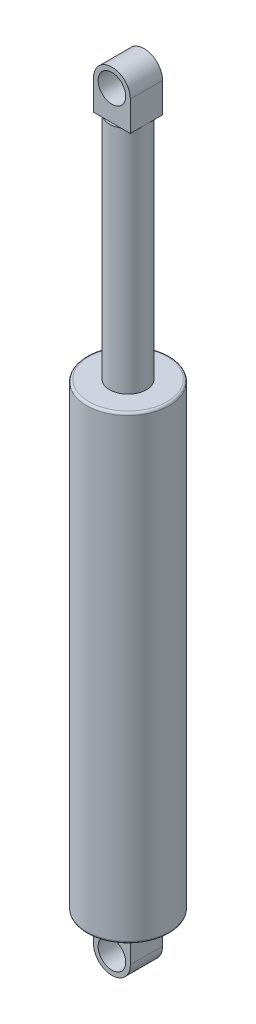
ISO-10303-21;
HEADER;
FILE_DESCRIPTION(('STEP AP214'),'2;1');
FILE_NAME('part.step','',(''),(''),'','','');
FILE_SCHEMA(('AUTOMOTIVE_DESIGN { 1 0 10303 214 1 1 1 1 }'));
ENDSEC;
DATA;
#1=APPLICATION_CONTEXT('core data for automotive mechanical design processes');
#2=APPLICATION_PROTOCOL_DEFINITION('international standard','automotive_design',2000,#1);
#3=PRODUCT_CONTEXT('',#1,'mechanical');
#4=PRODUCT('Part','Part','',(#3));
#5=PRODUCT_RELATED_PRODUCT_CATEGORY('part','',(#4));
#6=PRODUCT_DEFINITION_FORMATION('','',#4);
#7=PRODUCT_DEFINITION_CONTEXT('part definition',#1,'design');
#8=PRODUCT_DEFINITION('design','',#6,#7);
#9=PRODUCT_DEFINITION_SHAPE('','',#8);
#10=(LENGTH_UNIT() NAMED_UNIT(*) SI_UNIT(.MILLI.,.METRE.));
#11=(NAMED_UNIT(*) PLANE_ANGLE_UNIT() SI_UNIT($,.RADIAN.));
#12=(NAMED_UNIT(*) SI_UNIT($,.STERADIAN.) SOLID_ANGLE_UNIT());
#13=UNCERTAINTY_MEASURE_WITH_UNIT(LENGTH_MEASURE(1.E-05),#10,'distance_accuracy_value','');
#14=(GEOMETRIC_REPRESENTATION_CONTEXT(3) GLOBAL_UNCERTAINTY_ASSIGNED_CONTEXT((#13)) GLOBAL_UNIT_ASSIGNED_CONTEXT((#10,
#11,#12)) REPRESENTATION_CONTEXT('',''));
#15=CARTESIAN_POINT('',(0.,0.,0.));
#16=DIRECTION('',(0.,0.,1.));
#17=DIRECTION('',(1.,0.,0.));
#18=AXIS2_PLACEMENT_3D('',#15,#16,#17);
#19=CARTESIAN_POINT('',(0.,50.,0.));
#20=DIRECTION('',(0.,1.,0.));
#21=DIRECTION('',(0.,0.,1.));
#22=AXIS2_PLACEMENT_3D('',#19,#20,#21);
#23=PLANE('',#22);
#24=CARTESIAN_POINT('',(0.,50.,0.));
#25=DIRECTION('',(0.,1.,0.));
#26=DIRECTION('',(0.,0.,1.));
#27=AXIS2_PLACEMENT_3D('',#24,#25,#26);
#28=CIRCLE('',#27,4.);
#29=CARTESIAN_POINT('',(1.93649167310371,50.,-3.5));
#30=VERTEX_POINT('',#29);
#31=CARTESIAN_POINT('',(-1.93649167310371,50.,-3.5));
#32=VERTEX_POINT('',#31);
#33=EDGE_CURVE('E251',#30,#32,#28,.T.);
#34=ORIENTED_EDGE('',*,*,#33,.T.);
#35=DIRECTION('',(1.,0.,0.));
#36=VECTOR('',#35,1.);
#37=CARTESIAN_POINT('',(-3.99999999999999,50.,-3.5));
#38=LINE('',#37,#36);
#39=EDGE_CURVE('E11',#32,#30,#38,.T.);
#40=ORIENTED_EDGE('',*,*,#39,.T.);
#41=EDGE_LOOP('',(#34,#40));
#42=FACE_BOUND('',#41,.T.);
#43=ADVANCED_FACE('F40',(#42),#23,.T.);
#44=CARTESIAN_POINT('',(0.,50.,0.));
#45=DIRECTION('',(0.,-1.,0.));
#46=DIRECTION('',(0.,0.,-1.));
#47=AXIS2_PLACEMENT_3D('',#44,#45,#46);
#48=CYLINDRICAL_SURFACE('',#47,4.);
#49=CARTESIAN_POINT('',(1.93649167310371,50.,3.5));
#50=VERTEX_POINT('',#49);
#51=CARTESIAN_POINT('',(4.00000000000001,50.,0.));
#52=VERTEX_POINT('',#51);
#53=EDGE_CURVE('E186',#50,#52,#28,.T.);
#54=ORIENTED_EDGE('',*,*,#53,.F.);
#55=CARTESIAN_POINT('',(-1.93649167310371,50.,3.5));
#56=VERTEX_POINT('',#55);
#57=EDGE_CURVE('E191',#56,#50,#28,.T.);
#58=ORIENTED_EDGE('',*,*,#57,.F.);
#59=CARTESIAN_POINT('',(-3.99999999999999,50.,0.));
#60=VERTEX_POINT('',#59);
#61=EDGE_CURVE('E64',#60,#56,#28,.T.);
#62=ORIENTED_EDGE('',*,*,#61,.F.);
#63=EDGE_CURVE('E239',#32,#60,#28,.T.);
#64=ORIENTED_EDGE('',*,*,#63,.F.);
#65=ORIENTED_EDGE('',*,*,#33,.F.);
#66=EDGE_CURVE('E190',#52,#30,#28,.T.);
#67=ORIENTED_EDGE('',*,*,#66,.F.);
#68=EDGE_LOOP('',(#54,#58,#62,#64,#65,#67));
#69=FACE_BOUND('',#68,.T.);
#70=CARTESIAN_POINT('',(0.,0.,0.));
#71=DIRECTION('',(0.,1.,0.));
#72=DIRECTION('',(0.,0.,1.));
#73=AXIS2_PLACEMENT_3D('',#70,#71,#72);
#74=CIRCLE('',#73,4.);
#75=CARTESIAN_POINT('',(0.,0.,4.));
#76=VERTEX_POINT('',#75);
#77=EDGE_CURVE('E185',#76,#76,#74,.T.);
#78=ORIENTED_EDGE('',*,*,#77,.T.);
#79=EDGE_LOOP('',(#78));
#80=FACE_BOUND('',#79,.T.);
#81=ADVANCED_FACE('F253',(#69,#80),#48,.T.);
#82=DIRECTION('',(1.,0.,0.));
#83=VECTOR('',#82,1.);
#84=CARTESIAN_POINT('',(-3.99999999999999,50.,3.5));
#85=LINE('',#84,#83);
#86=EDGE_CURVE('E49',#56,#50,#85,.T.);
#87=ORIENTED_EDGE('',*,*,#86,.F.);
#88=ORIENTED_EDGE('',*,*,#57,.T.);
#89=EDGE_LOOP('',(#87,#88));
#90=FACE_BOUND('',#89,.T.);
#91=ADVANCED_FACE('F260',(#90),#23,.T.);
#92=CARTESIAN_POINT('',(0.,-100.,0.));
#93=DIRECTION('',(0.,1.,0.));
#94=DIRECTION('',(0.,0.,1.));
#95=AXIS2_PLACEMENT_3D('',#92,#93,#94);
#96=CYLINDRICAL_SURFACE('',#95,9.);
#97=CARTESIAN_POINT('',(0.,-0.5,0.));
#98=DIRECTION('',(0.,-1.,0.));
#99=DIRECTION('',(0.,0.,-1.));
#100=AXIS2_PLACEMENT_3D('',#97,#98,#99);
#101=CIRCLE('',#100,9.);
#102=CARTESIAN_POINT('',(0.,-0.5,-9.));
#103=VERTEX_POINT('',#102);
#104=EDGE_CURVE('E196',#103,#103,#101,.T.);
#105=ORIENTED_EDGE('',*,*,#104,.T.);
#106=EDGE_LOOP('',(#105));
#107=FACE_BOUND('',#106,.T.);
#108=CARTESIAN_POINT('',(0.,-99.5,0.));
#109=DIRECTION('',(0.,-1.,0.));
#110=DIRECTION('',(0.,0.,-1.));
#111=AXIS2_PLACEMENT_3D('',#108,#109,#110);
#112=CIRCLE('',#111,9.);
#113=CARTESIAN_POINT('',(0.,-99.5,-9.));
#114=VERTEX_POINT('',#113);
#115=EDGE_CURVE('E189',#114,#114,#112,.F.);
#116=ORIENTED_EDGE('',*,*,#115,.T.);
#117=EDGE_LOOP('',(#116));
#118=FACE_BOUND('',#117,.T.);
#119=ADVANCED_FACE('F281',(#107,#118),#96,.T.);
#120=CARTESIAN_POINT('',(0.,-100.,0.));
#121=DIRECTION('',(0.,-1.,0.));
#122=DIRECTION('',(0.,0.,-1.));
#123=AXIS2_PLACEMENT_3D('',#120,#121,#122);
#124=PLANE('',#123);
#125=DIRECTION('',(-1.,0.,0.));
#126=VECTOR('',#125,1.);
#127=CARTESIAN_POINT('',(-4.00000000000001,-100.,3.5));
#128=LINE('',#127,#126);
#129=CARTESIAN_POINT('',(3.99999999999999,-100.,3.5));
#130=VERTEX_POINT('',#129);
#131=CARTESIAN_POINT('',(-4.00000000000001,-100.,3.5));
#132=VERTEX_POINT('',#131);
#133=EDGE_CURVE('E161',#130,#132,#128,.T.);
#134=ORIENTED_EDGE('',*,*,#133,.F.);
#135=DIRECTION('',(0.,0.,-1.));
#136=VECTOR('',#135,1.);
#137=CARTESIAN_POINT('',(3.99999999999999,-100.,3.5));
#138=LINE('',#137,#136);
#139=CARTESIAN_POINT('',(3.99999999999999,-100.,-3.5));
#140=VERTEX_POINT('',#139);
#141=EDGE_CURVE('E182',#130,#140,#138,.T.);
#142=ORIENTED_EDGE('',*,*,#141,.T.);
#143=DIRECTION('',(-1.,0.,0.));
#144=VECTOR('',#143,1.);
#145=CARTESIAN_POINT('',(-4.00000000000001,-100.,-3.5));
#146=LINE('',#145,#144);
#147=CARTESIAN_POINT('',(-4.00000000000001,-100.,-3.5));
#148=VERTEX_POINT('',#147);
#149=EDGE_CURVE('E153',#140,#148,#146,.T.);
#150=ORIENTED_EDGE('',*,*,#149,.T.);
#151=DIRECTION('',(0.,0.,-1.));
#152=VECTOR('',#151,1.);
#153=CARTESIAN_POINT('',(-4.00000000000001,-100.,3.5));
#154=LINE('',#153,#152);
#155=EDGE_CURVE('E179',#132,#148,#154,.T.);
#156=ORIENTED_EDGE('',*,*,#155,.F.);
#157=EDGE_LOOP('',(#134,#142,#150,#156));
#158=FACE_BOUND('',#157,.T.);
#159=CARTESIAN_POINT('',(0.,-100.,0.));
#160=DIRECTION('',(0.,-1.,0.));
#161=DIRECTION('',(0.,0.,-1.));
#162=AXIS2_PLACEMENT_3D('',#159,#160,#161);
#163=CIRCLE('',#162,8.5);
#164=CARTESIAN_POINT('',(0.,-100.,-8.5));
#165=VERTEX_POINT('',#164);
#166=EDGE_CURVE('E202',#165,#165,#163,.T.);
#167=ORIENTED_EDGE('',*,*,#166,.T.);
#168=EDGE_LOOP('',(#167));
#169=FACE_BOUND('',#168,.T.);
#170=ADVANCED_FACE('F285',(#158,#169),#124,.T.);
#171=CARTESIAN_POINT('',(0.,0.,0.));
#172=DIRECTION('',(0.,-1.,0.));
#173=DIRECTION('',(0.,0.,-1.));
#174=AXIS2_PLACEMENT_3D('',#171,#172,#173);
#175=PLANE('',#174);
#176=CARTESIAN_POINT('',(0.,0.,0.));
#177=DIRECTION('',(0.,-1.,0.));
#178=DIRECTION('',(0.,0.,-1.));
#179=AXIS2_PLACEMENT_3D('',#176,#177,#178);
#180=CIRCLE('',#179,8.5);
#181=CARTESIAN_POINT('',(0.,0.,-8.5));
#182=VERTEX_POINT('',#181);
#183=EDGE_CURVE('E199',#182,#182,#180,.F.);
#184=ORIENTED_EDGE('',*,*,#183,.T.);
#185=EDGE_LOOP('',(#184));
#186=FACE_BOUND('',#185,.T.);
#187=ORIENTED_EDGE('',*,*,#77,.F.);
#188=EDGE_LOOP('',(#187));
#189=FACE_BOUND('',#188,.T.);
#190=ADVANCED_FACE('F290',(#186,#189),#175,.F.);
#191=CARTESIAN_POINT('',(0.,-0.5,0.));
#192=DIRECTION('',(0.,-1.,0.));
#193=DIRECTION('',(0.,0.,-1.));
#194=AXIS2_PLACEMENT_3D('',#191,#192,#193);
#195=TOROIDAL_SURFACE('',#194,8.5,0.5);
#196=ORIENTED_EDGE('',*,*,#183,.F.);
#197=EDGE_LOOP('',(#196));
#198=FACE_BOUND('',#197,.T.);
#199=ORIENTED_EDGE('',*,*,#104,.F.);
#200=EDGE_LOOP('',(#199));
#201=FACE_BOUND('',#200,.T.);
#202=ADVANCED_FACE('F296',(#198,#201),#195,.T.);
#203=CARTESIAN_POINT('',(0.,-99.5,0.));
#204=DIRECTION('',(0.,-1.,0.));
#205=DIRECTION('',(0.,0.,-1.));
#206=AXIS2_PLACEMENT_3D('',#203,#204,#205);
#207=TOROIDAL_SURFACE('',#206,8.5,0.5);
#208=ORIENTED_EDGE('',*,*,#115,.F.);
#209=EDGE_LOOP('',(#208));
#210=FACE_BOUND('',#209,.T.);
#211=ORIENTED_EDGE('',*,*,#166,.F.);
#212=EDGE_LOOP('',(#211));
#213=FACE_BOUND('',#212,.T.);
#214=ADVANCED_FACE('F42',(#210,#213),#207,.T.);
#215=CARTESIAN_POINT('',(3.99999999999999,-106.507163193013,3.5));
#216=DIRECTION('',(-1.,0.,0.));
#217=DIRECTION('',(0.,0.,1.));
#218=AXIS2_PLACEMENT_3D('',#215,#216,#217);
#219=PLANE('',#218);
#220=DIRECTION('',(0.,1.,0.));
#221=VECTOR('',#220,1.);
#222=CARTESIAN_POINT('',(3.99999999999999,-106.507163193013,-3.5));
#223=LINE('',#222,#221);
#224=CARTESIAN_POINT('',(3.99999999999999,-106.507163193013,-3.5));
#225=VERTEX_POINT('',#224);
#226=EDGE_CURVE('E150',#225,#140,#223,.T.);
#227=ORIENTED_EDGE('',*,*,#226,.T.);
#228=ORIENTED_EDGE('',*,*,#141,.F.);
#229=DIRECTION('',(0.,1.,0.));
#230=VECTOR('',#229,1.);
#231=CARTESIAN_POINT('',(3.99999999999999,-106.507163193013,3.5));
#232=LINE('',#231,#230);
#233=CARTESIAN_POINT('',(3.99999999999999,-106.507163193013,3.5));
#234=VERTEX_POINT('',#233);
#235=EDGE_CURVE('E159',#234,#130,#232,.T.);
#236=ORIENTED_EDGE('',*,*,#235,.F.);
#237=DIRECTION('',(0.,0.,-1.));
#238=VECTOR('',#237,1.);
#239=CARTESIAN_POINT('',(3.99999999999999,-106.507163193013,3.5));
#240=LINE('',#239,#238);
#241=EDGE_CURVE('E167',#234,#225,#240,.T.);
#242=ORIENTED_EDGE('',*,*,#241,.T.);
#243=EDGE_LOOP('',(#227,#228,#236,#242));
#244=FACE_BOUND('',#243,.T.);
#245=ADVANCED_FACE('F299',(#244),#219,.F.);
#246=CARTESIAN_POINT('',(-4.00000000000001,-106.507163193013,3.5));
#247=DIRECTION('',(1.,0.,0.));
#248=DIRECTION('',(0.,0.,-1.));
#249=AXIS2_PLACEMENT_3D('',#246,#247,#248);
#250=PLANE('',#249);
#251=DIRECTION('',(0.,-1.,0.));
#252=VECTOR('',#251,1.);
#253=CARTESIAN_POINT('',(-4.00000000000001,-106.507163193013,-3.5));
#254=LINE('',#253,#252);
#255=CARTESIAN_POINT('',(-4.00000000000001,-106.507163193013,-3.5));
#256=VERTEX_POINT('',#255);
#257=EDGE_CURVE('E171',#148,#256,#254,.T.);
#258=ORIENTED_EDGE('',*,*,#257,.T.);
#259=DIRECTION('',(0.,0.,-1.));
#260=VECTOR('',#259,1.);
#261=CARTESIAN_POINT('',(-4.00000000000001,-106.507163193013,3.5));
#262=LINE('',#261,#260);
#263=CARTESIAN_POINT('',(-4.00000000000001,-106.507163193013,3.5));
#264=VERTEX_POINT('',#263);
#265=EDGE_CURVE('E176',#264,#256,#262,.T.);
#266=ORIENTED_EDGE('',*,*,#265,.F.);
#267=DIRECTION('',(0.,-1.,0.));
#268=VECTOR('',#267,1.);
#269=CARTESIAN_POINT('',(-4.00000000000001,-106.507163193013,3.5));
#270=LINE('',#269,#268);
#271=EDGE_CURVE('E164',#132,#264,#270,.T.);
#272=ORIENTED_EDGE('',*,*,#271,.F.);
#273=ORIENTED_EDGE('',*,*,#155,.T.);
#274=EDGE_LOOP('',(#258,#266,#272,#273));
#275=FACE_BOUND('',#274,.T.);
#276=ADVANCED_FACE('F302',(#275),#250,.F.);
#277=CARTESIAN_POINT('',(0.,-106.507163193013,3.5));
#278=DIRECTION('',(0.,0.,-1.));
#279=DIRECTION('',(-1.,0.,0.));
#280=AXIS2_PLACEMENT_3D('',#277,#278,#279);
#281=CYLINDRICAL_SURFACE('',#280,4.);
#282=CARTESIAN_POINT('',(0.,-106.507163193013,-3.5));
#283=DIRECTION('',(0.,0.,1.));
#284=DIRECTION('',(1.,0.,0.));
#285=AXIS2_PLACEMENT_3D('',#282,#283,#284);
#286=CIRCLE('',#285,4.);
#287=EDGE_CURVE('E162',#256,#225,#286,.T.);
#288=ORIENTED_EDGE('',*,*,#287,.T.);
#289=ORIENTED_EDGE('',*,*,#241,.F.);
#290=CARTESIAN_POINT('',(0.,-106.507163193013,3.5));
#291=DIRECTION('',(0.,0.,1.));
#292=DIRECTION('',(1.,0.,0.));
#293=AXIS2_PLACEMENT_3D('',#290,#291,#292);
#294=CIRCLE('',#293,4.);
#295=EDGE_CURVE('E166',#264,#234,#294,.T.);
#296=ORIENTED_EDGE('',*,*,#295,.F.);
#297=ORIENTED_EDGE('',*,*,#265,.T.);
#298=EDGE_LOOP('',(#288,#289,#296,#297));
#299=FACE_BOUND('',#298,.T.);
#300=ADVANCED_FACE('F306',(#299),#281,.T.);
#301=CARTESIAN_POINT('',(0.,-106.507163193013,3.5));
#302=DIRECTION('',(0.,0.,1.));
#303=DIRECTION('',(1.,0.,0.));
#304=AXIS2_PLACEMENT_3D('',#301,#302,#303);
#305=PLANE('',#304);
#306=CARTESIAN_POINT('',(0.,-106.507163193013,3.5));
#307=DIRECTION('',(0.,0.,1.));
#308=DIRECTION('',(1.,0.,0.));
#309=AXIS2_PLACEMENT_3D('',#306,#307,#308);
#310=CIRCLE('',#309,3.);
#311=CARTESIAN_POINT('',(2.99999999999999,-106.507163193013,3.5));
#312=VERTEX_POINT('',#311);
#313=EDGE_CURVE('E216',#312,#312,#310,.T.);
#314=ORIENTED_EDGE('',*,*,#313,.F.);
#315=EDGE_LOOP('',(#314));
#316=FACE_BOUND('',#315,.T.);
#317=ORIENTED_EDGE('',*,*,#235,.T.);
#318=ORIENTED_EDGE('',*,*,#133,.T.);
#319=ORIENTED_EDGE('',*,*,#271,.T.);
#320=ORIENTED_EDGE('',*,*,#295,.T.);
#321=EDGE_LOOP('',(#317,#318,#319,#320));
#322=FACE_BOUND('',#321,.T.);
#323=ADVANCED_FACE('F310',(#316,#322),#305,.T.);
#324=CARTESIAN_POINT('',(0.,-106.507163193013,-3.5));
#325=DIRECTION('',(0.,0.,1.));
#326=DIRECTION('',(1.,0.,0.));
#327=AXIS2_PLACEMENT_3D('',#324,#325,#326);
#328=PLANE('',#327);
#329=CARTESIAN_POINT('',(0.,-106.507163193013,-3.5));
#330=DIRECTION('',(0.,0.,1.));
#331=DIRECTION('',(1.,0.,0.));
#332=AXIS2_PLACEMENT_3D('',#329,#330,#331);
#333=CIRCLE('',#332,3.);
#334=CARTESIAN_POINT('',(2.99999999999999,-106.507163193013,-3.5));
#335=VERTEX_POINT('',#334);
#336=EDGE_CURVE('E44',#335,#335,#333,.T.);
#337=ORIENTED_EDGE('',*,*,#336,.T.);
#338=EDGE_LOOP('',(#337));
#339=FACE_BOUND('',#338,.T.);
#340=ORIENTED_EDGE('',*,*,#226,.F.);
#341=ORIENTED_EDGE('',*,*,#287,.F.);
#342=ORIENTED_EDGE('',*,*,#257,.F.);
#343=ORIENTED_EDGE('',*,*,#149,.F.);
#344=EDGE_LOOP('',(#340,#341,#342,#343));
#345=FACE_BOUND('',#344,.T.);
#346=ADVANCED_FACE('F272',(#339,#345),#328,.F.);
#347=CARTESIAN_POINT('',(-3.99999999999999,50.,3.5));
#348=DIRECTION('',(0.,1.,0.));
#349=DIRECTION('',(0.,0.,1.));
#350=AXIS2_PLACEMENT_3D('',#347,#348,#349);
#351=PLANE('',#350);
#352=CARTESIAN_POINT('',(4.00000000000001,50.,3.5));
#353=VERTEX_POINT('',#352);
#354=EDGE_CURVE('E142',#50,#353,#85,.T.);
#355=ORIENTED_EDGE('',*,*,#354,.F.);
#356=ORIENTED_EDGE('',*,*,#53,.T.);
#357=DIRECTION('',(0.,0.,-1.));
#358=VECTOR('',#357,1.);
#359=CARTESIAN_POINT('',(4.00000000000001,50.,3.5));
#360=LINE('',#359,#358);
#361=EDGE_CURVE('E229',#353,#52,#360,.T.);
#362=ORIENTED_EDGE('',*,*,#361,.F.);
#363=EDGE_LOOP('',(#355,#356,#362));
#364=FACE_BOUND('',#363,.T.);
#365=ADVANCED_FACE('F259',(#364),#351,.F.);
#366=CARTESIAN_POINT('',(4.00000000000001,50.,-3.5));
#367=VERTEX_POINT('',#366);
#368=EDGE_CURVE('E222',#52,#367,#360,.T.);
#369=ORIENTED_EDGE('',*,*,#368,.F.);
#370=ORIENTED_EDGE('',*,*,#66,.T.);
#371=EDGE_CURVE('E52',#30,#367,#38,.T.);
#372=ORIENTED_EDGE('',*,*,#371,.T.);
#373=EDGE_LOOP('',(#369,#370,#372));
#374=FACE_BOUND('',#373,.T.);
#375=ADVANCED_FACE('F257',(#374),#351,.F.);
#376=CARTESIAN_POINT('',(-3.99999999999999,50.,-3.5));
#377=VERTEX_POINT('',#376);
#378=EDGE_CURVE('E51',#377,#32,#38,.T.);
#379=ORIENTED_EDGE('',*,*,#378,.T.);
#380=ORIENTED_EDGE('',*,*,#63,.T.);
#381=DIRECTION('',(0.,0.,-1.));
#382=VECTOR('',#381,1.);
#383=CARTESIAN_POINT('',(-3.99999999999999,50.,3.5));
#384=LINE('',#383,#382);
#385=EDGE_CURVE('E230',#60,#377,#384,.T.);
#386=ORIENTED_EDGE('',*,*,#385,.T.);
#387=EDGE_LOOP('',(#379,#380,#386));
#388=FACE_BOUND('',#387,.T.);
#389=ADVANCED_FACE('F237',(#388),#351,.F.);
#390=CARTESIAN_POINT('',(-3.99999999999999,50.,3.5));
#391=VERTEX_POINT('',#390);
#392=EDGE_CURVE('E155',#391,#60,#384,.T.);
#393=ORIENTED_EDGE('',*,*,#392,.T.);
#394=ORIENTED_EDGE('',*,*,#61,.T.);
#395=EDGE_CURVE('E220',#391,#56,#85,.T.);
#396=ORIENTED_EDGE('',*,*,#395,.F.);
#397=EDGE_LOOP('',(#393,#394,#396));
#398=FACE_BOUND('',#397,.T.);
#399=ADVANCED_FACE('F261',(#398),#351,.F.);
#400=CARTESIAN_POINT('',(4.00000000000001,56.5,3.5));
#401=DIRECTION('',(-1.,0.,0.));
#402=DIRECTION('',(0.,-1.,0.));
#403=AXIS2_PLACEMENT_3D('',#400,#401,#402);
#404=PLANE('',#403);
#405=DIRECTION('',(0.,1.,0.));
#406=VECTOR('',#405,1.);
#407=CARTESIAN_POINT('',(4.00000000000001,56.5,-3.5));
#408=LINE('',#407,#406);
#409=CARTESIAN_POINT('',(4.,56.5,-3.5));
#410=VERTEX_POINT('',#409);
#411=EDGE_CURVE('E149',#367,#410,#408,.T.);
#412=ORIENTED_EDGE('',*,*,#411,.T.);
#413=DIRECTION('',(0.,0.,-1.));
#414=VECTOR('',#413,1.);
#415=CARTESIAN_POINT('',(4.,56.5,3.5));
#416=LINE('',#415,#414);
#417=CARTESIAN_POINT('',(4.,56.5,3.5));
#418=VERTEX_POINT('',#417);
#419=EDGE_CURVE('E130',#418,#410,#416,.T.);
#420=ORIENTED_EDGE('',*,*,#419,.F.);
#421=DIRECTION('',(0.,1.,0.));
#422=VECTOR('',#421,1.);
#423=CARTESIAN_POINT('',(4.00000000000001,56.5,3.5));
#424=LINE('',#423,#422);
#425=EDGE_CURVE('E137',#353,#418,#424,.T.);
#426=ORIENTED_EDGE('',*,*,#425,.F.);
#427=ORIENTED_EDGE('',*,*,#361,.T.);
#428=ORIENTED_EDGE('',*,*,#368,.T.);
#429=EDGE_LOOP('',(#412,#420,#426,#427,#428));
#430=FACE_BOUND('',#429,.T.);
#431=ADVANCED_FACE('F147',(#430),#404,.F.);
#432=CARTESIAN_POINT('',(0.,56.4999998159312,3.5));
#433=DIRECTION('',(0.,0.,-1.));
#434=DIRECTION('',(-1.,0.,0.));
#435=AXIS2_PLACEMENT_3D('',#432,#433,#434);
#436=CYLINDRICAL_SURFACE('',#435,4.);
#437=CARTESIAN_POINT('',(0.,56.4999998159312,-3.5));
#438=DIRECTION('',(0.,0.,1.));
#439=DIRECTION('',(1.,0.,0.));
#440=AXIS2_PLACEMENT_3D('',#437,#438,#439);
#441=CIRCLE('',#440,4.);
#442=CARTESIAN_POINT('',(-3.99999999999999,56.5,-3.5));
#443=VERTEX_POINT('',#442);
#444=EDGE_CURVE('E209',#410,#443,#441,.T.);
#445=ORIENTED_EDGE('',*,*,#444,.T.);
#446=DIRECTION('',(0.,0.,-1.));
#447=VECTOR('',#446,1.);
#448=CARTESIAN_POINT('',(-3.99999999999999,56.5,3.5));
#449=LINE('',#448,#447);
#450=CARTESIAN_POINT('',(-3.99999999999999,56.5,3.5));
#451=VERTEX_POINT('',#450);
#452=EDGE_CURVE('E133',#451,#443,#449,.T.);
#453=ORIENTED_EDGE('',*,*,#452,.F.);
#454=CARTESIAN_POINT('',(0.,56.4999998159312,3.5));
#455=DIRECTION('',(0.,0.,1.));
#456=DIRECTION('',(1.,0.,0.));
#457=AXIS2_PLACEMENT_3D('',#454,#455,#456);
#458=CIRCLE('',#457,4.);
#459=EDGE_CURVE('E126',#418,#451,#458,.T.);
#460=ORIENTED_EDGE('',*,*,#459,.F.);
#461=ORIENTED_EDGE('',*,*,#419,.T.);
#462=EDGE_LOOP('',(#445,#453,#460,#461));
#463=FACE_BOUND('',#462,.T.);
#464=ADVANCED_FACE('F128',(#463),#436,.T.);
#465=CARTESIAN_POINT('',(-3.99999999999999,56.5,3.5));
#466=DIRECTION('',(1.,0.,0.));
#467=DIRECTION('',(0.,1.,0.));
#468=AXIS2_PLACEMENT_3D('',#465,#466,#467);
#469=PLANE('',#468);
#470=DIRECTION('',(0.,-1.,0.));
#471=VECTOR('',#470,1.);
#472=CARTESIAN_POINT('',(-3.99999999999999,56.5,-3.5));
#473=LINE('',#472,#471);
#474=EDGE_CURVE('E225',#443,#377,#473,.T.);
#475=ORIENTED_EDGE('',*,*,#474,.T.);
#476=ORIENTED_EDGE('',*,*,#385,.F.);
#477=ORIENTED_EDGE('',*,*,#392,.F.);
#478=DIRECTION('',(0.,-1.,0.));
#479=VECTOR('',#478,1.);
#480=CARTESIAN_POINT('',(-3.99999999999999,56.5,3.5));
#481=LINE('',#480,#479);
#482=EDGE_CURVE('E136',#451,#391,#481,.T.);
#483=ORIENTED_EDGE('',*,*,#482,.F.);
#484=ORIENTED_EDGE('',*,*,#452,.T.);
#485=EDGE_LOOP('',(#475,#476,#477,#483,#484));
#486=FACE_BOUND('',#485,.T.);
#487=ADVANCED_FACE('F242',(#486),#469,.F.);
#488=CARTESIAN_POINT('',(0.,56.4999998159312,3.5));
#489=DIRECTION('',(0.,0.,1.));
#490=DIRECTION('',(1.,0.,0.));
#491=AXIS2_PLACEMENT_3D('',#488,#489,#490);
#492=PLANE('',#491);
#493=CARTESIAN_POINT('',(0.,56.4999998159312,3.5));
#494=DIRECTION('',(0.,0.,1.));
#495=DIRECTION('',(1.,0.,0.));
#496=AXIS2_PLACEMENT_3D('',#493,#494,#495);
#497=CIRCLE('',#496,3.);
#498=CARTESIAN_POINT('',(3.00000000000001,56.4999998159312,3.5));
#499=VERTEX_POINT('',#498);
#500=EDGE_CURVE('E206',#499,#499,#497,.T.);
#501=ORIENTED_EDGE('',*,*,#500,.F.);
#502=EDGE_LOOP('',(#501));
#503=FACE_BOUND('',#502,.T.);
#504=ORIENTED_EDGE('',*,*,#425,.T.);
#505=ORIENTED_EDGE('',*,*,#459,.T.);
#506=ORIENTED_EDGE('',*,*,#482,.T.);
#507=ORIENTED_EDGE('',*,*,#395,.T.);
#508=ORIENTED_EDGE('',*,*,#86,.T.);
#509=ORIENTED_EDGE('',*,*,#354,.T.);
#510=EDGE_LOOP('',(#504,#505,#506,#507,#508,#509));
#511=FACE_BOUND('',#510,.T.);
#512=ADVANCED_FACE('F140',(#503,#511),#492,.T.);
#513=CARTESIAN_POINT('',(0.,56.4999998159312,-3.5));
#514=DIRECTION('',(0.,0.,1.));
#515=DIRECTION('',(1.,0.,0.));
#516=AXIS2_PLACEMENT_3D('',#513,#514,#515);
#517=PLANE('',#516);
#518=CARTESIAN_POINT('',(0.,56.4999998159312,-3.5));
#519=DIRECTION('',(0.,0.,1.));
#520=DIRECTION('',(1.,0.,0.));
#521=AXIS2_PLACEMENT_3D('',#518,#519,#520);
#522=CIRCLE('',#521,3.);
#523=CARTESIAN_POINT('',(3.00000000000001,56.4999998159312,-3.5));
#524=VERTEX_POINT('',#523);
#525=EDGE_CURVE('E204',#524,#524,#522,.T.);
#526=ORIENTED_EDGE('',*,*,#525,.T.);
#527=EDGE_LOOP('',(#526));
#528=FACE_BOUND('',#527,.T.);
#529=ORIENTED_EDGE('',*,*,#411,.F.);
#530=ORIENTED_EDGE('',*,*,#371,.F.);
#531=ORIENTED_EDGE('',*,*,#39,.F.);
#532=ORIENTED_EDGE('',*,*,#378,.F.);
#533=ORIENTED_EDGE('',*,*,#474,.F.);
#534=ORIENTED_EDGE('',*,*,#444,.F.);
#535=EDGE_LOOP('',(#529,#530,#531,#532,#533,#534));
#536=FACE_BOUND('',#535,.T.);
#537=ADVANCED_FACE('F245',(#528,#536),#517,.F.);
#538=CARTESIAN_POINT('',(0.,56.4999998159312,-9.));
#539=DIRECTION('',(0.,0.,1.));
#540=DIRECTION('',(1.,0.,0.));
#541=AXIS2_PLACEMENT_3D('',#538,#539,#540);
#542=CYLINDRICAL_SURFACE('',#541,3.);
#543=CARTESIAN_POINT('',(3.00000000000001,56.4999998159312,3.5));
#544=CARTESIAN_POINT('',(3.00000000000001,56.4999998159312,3.42708333333333));
#545=CARTESIAN_POINT('',(3.00000000000001,56.4999998159312,3.35416666666667));
#546=CARTESIAN_POINT('',(3.00000000000001,56.4999998159312,3.20833333333333));
#547=CARTESIAN_POINT('',(3.00000000000001,56.4999998159312,3.13541666666667));
#548=CARTESIAN_POINT('',(3.00000000000001,56.4999998159312,2.98958333333333));
#549=CARTESIAN_POINT('',(3.00000000000001,56.4999998159312,2.91666666666667));
#550=CARTESIAN_POINT('',(3.00000000000001,56.4999998159312,2.77083333333333));
#551=CARTESIAN_POINT('',(3.00000000000001,56.4999998159312,2.69791666666667));
#552=CARTESIAN_POINT('',(3.00000000000001,56.4999998159312,2.55208333333333));
#553=CARTESIAN_POINT('',(3.00000000000001,56.4999998159312,2.47916666666667));
#554=CARTESIAN_POINT('',(3.00000000000001,56.4999998159312,2.33333333333333));
#555=CARTESIAN_POINT('',(3.00000000000001,56.4999998159312,2.26041666666667));
#556=CARTESIAN_POINT('',(3.00000000000001,56.4999998159312,2.11458333333333));
#557=CARTESIAN_POINT('',(3.00000000000001,56.4999998159312,2.04166666666667));
#558=CARTESIAN_POINT('',(3.00000000000001,56.4999998159312,1.89583333333333));
#559=CARTESIAN_POINT('',(3.00000000000001,56.4999998159312,1.82291666666667));
#560=CARTESIAN_POINT('',(3.00000000000001,56.4999998159312,1.67708333333333));
#561=CARTESIAN_POINT('',(3.00000000000001,56.4999998159312,1.60416666666667));
#562=CARTESIAN_POINT('',(3.00000000000001,56.4999998159312,1.45833333333333));
#563=CARTESIAN_POINT('',(3.00000000000001,56.4999998159312,1.38541666666667));
#564=CARTESIAN_POINT('',(3.00000000000001,56.4999998159312,1.23958333333333));
#565=CARTESIAN_POINT('',(3.00000000000001,56.4999998159312,1.16666666666667));
#566=CARTESIAN_POINT('',(3.00000000000001,56.4999998159312,1.02083333333333));
#567=CARTESIAN_POINT('',(3.00000000000001,56.4999998159312,0.947916666666666));
#568=CARTESIAN_POINT('',(3.00000000000001,56.4999998159312,0.802083333333332));
#569=CARTESIAN_POINT('',(3.00000000000001,56.4999998159312,0.729166666666666));
#570=CARTESIAN_POINT('',(3.00000000000001,56.4999998159312,0.583333333333332));
#571=CARTESIAN_POINT('',(3.00000000000001,56.4999998159312,0.510416666666665));
#572=CARTESIAN_POINT('',(3.00000000000001,56.4999998159312,0.364583333333332));
#573=CARTESIAN_POINT('',(3.00000000000001,56.4999998159312,0.291666666666666));
#574=CARTESIAN_POINT('',(3.00000000000001,56.4999998159312,0.145833333333333));
#575=CARTESIAN_POINT('',(3.00000000000001,56.4999998159312,0.0729166666666667));
#576=CARTESIAN_POINT('',(3.00000000000001,56.4999998159312,-0.0729166666666667));
#577=CARTESIAN_POINT('',(3.00000000000001,56.4999998159312,-0.145833333333333));
#578=CARTESIAN_POINT('',(3.00000000000001,56.4999998159312,-0.291666666666667));
#579=CARTESIAN_POINT('',(3.00000000000001,56.4999998159312,-0.364583333333334));
#580=CARTESIAN_POINT('',(3.00000000000001,56.4999998159312,-0.510416666666667));
#581=CARTESIAN_POINT('',(3.00000000000001,56.4999998159312,-0.583333333333334));
#582=CARTESIAN_POINT('',(3.00000000000001,56.4999998159312,-0.729166666666667));
#583=CARTESIAN_POINT('',(3.00000000000001,56.4999998159312,-0.802083333333334));
#584=CARTESIAN_POINT('',(3.00000000000001,56.4999998159312,-0.947916666666668));
#585=CARTESIAN_POINT('',(3.00000000000001,56.4999998159312,-1.02083333333333));
#586=CARTESIAN_POINT('',(3.00000000000001,56.4999998159312,-1.16666666666667));
#587=CARTESIAN_POINT('',(3.00000000000001,56.4999998159312,-1.23958333333333));
#588=CARTESIAN_POINT('',(3.00000000000001,56.4999998159312,-1.38541666666667));
#589=CARTESIAN_POINT('',(3.00000000000001,56.4999998159312,-1.45833333333333));
#590=CARTESIAN_POINT('',(3.00000000000001,56.4999998159312,-1.60416666666667));
#591=CARTESIAN_POINT('',(3.00000000000001,56.4999998159312,-1.67708333333333));
#592=CARTESIAN_POINT('',(3.00000000000001,56.4999998159312,-1.82291666666667));
#593=CARTESIAN_POINT('',(3.00000000000001,56.4999998159312,-1.89583333333333));
#594=CARTESIAN_POINT('',(3.00000000000001,56.4999998159312,-2.04166666666667));
#595=CARTESIAN_POINT('',(3.00000000000001,56.4999998159312,-2.11458333333333));
#596=CARTESIAN_POINT('',(3.00000000000001,56.4999998159312,-2.26041666666667));
#597=CARTESIAN_POINT('',(3.00000000000001,56.4999998159312,-2.33333333333333));
#598=CARTESIAN_POINT('',(3.00000000000001,56.4999998159312,-2.47916666666667));
#599=CARTESIAN_POINT('',(3.00000000000001,56.4999998159312,-2.55208333333333));
#600=CARTESIAN_POINT('',(3.00000000000001,56.4999998159312,-2.69791666666667));
#601=CARTESIAN_POINT('',(3.00000000000001,56.4999998159312,-2.77083333333333));
#602=CARTESIAN_POINT('',(3.00000000000001,56.4999998159312,-2.91666666666667));
#603=CARTESIAN_POINT('',(3.00000000000001,56.4999998159312,-2.98958333333333));
#604=CARTESIAN_POINT('',(3.00000000000001,56.4999998159312,-3.13541666666667));
#605=CARTESIAN_POINT('',(3.00000000000001,56.4999998159312,-3.20833333333333));
#606=CARTESIAN_POINT('',(3.00000000000001,56.4999998159312,-3.35416666666667));
#607=CARTESIAN_POINT('',(3.00000000000001,56.4999998159312,-3.42708333333333));
#608=CARTESIAN_POINT('',(3.00000000000001,56.4999998159312,-3.5));
#609=B_SPLINE_CURVE_WITH_KNOTS('',3,(#543,#544,#545,#546,#547,#548,#549,#550,#551,#552,#553,
#554,#555,#556,#557,#558,#559,#560,#561,#562,#563,#564,#565,#566,#567,#568,#569,#570,#571,#572,
#573,#574,#575,#576,#577,#578,#579,#580,#581,#582,#583,#584,#585,#586,#587,#588,#589,#590,#591,
#592,#593,#594,#595,#596,#597,#598,#599,#600,#601,#602,#603,#604,#605,#606,#607,#608),
.UNSPECIFIED.,.F.,.F.,(4,2,2,2,2,2,2,2,2,2,2,2,2,2,2,2,2,2,2,2,2,2,2,2,2,2,2,2,2,2,2,2,4),(0.,
0.21875,0.4375,0.656250000000001,0.875000000000001,1.09375,1.3125,1.53125,1.75,1.96875,2.1875,
2.40625,2.625,2.84375,3.0625,3.28125,3.5,3.71875,3.9375,4.15625,4.375,4.59375,4.8125,5.03125,
5.25,5.46875,5.6875,5.90625,6.125,6.34375,6.5625,6.78125,7.),.UNSPECIFIED.);
#610=EDGE_CURVE('BSEAM328',#499,#524,#609,.T.);
#611=ORIENTED_EDGE('',*,*,#500,.T.);
#612=ORIENTED_EDGE('',*,*,#525,.F.);
#613=ORIENTED_EDGE('',*,*,#610,.T.);
#614=ORIENTED_EDGE('',*,*,#610,.F.);
#615=EDGE_LOOP('',(#611,#613,#612,#614));
#616=FACE_BOUND('',#615,.T.);
#617=ADVANCED_FACE('F328',(#616),#542,.F.);
#618=CARTESIAN_POINT('',(0.,-106.507163193013,-9.));
#619=DIRECTION('',(0.,0.,1.));
#620=DIRECTION('',(1.,0.,0.));
#621=AXIS2_PLACEMENT_3D('',#618,#619,#620);
#622=CYLINDRICAL_SURFACE('',#621,3.);
#623=CARTESIAN_POINT('',(2.99999999999999,-106.507163193013,3.5));
#624=CARTESIAN_POINT('',(2.99999999999999,-106.507163193013,3.42708333333333));
#625=CARTESIAN_POINT('',(2.99999999999999,-106.507163193013,3.35416666666667));
#626=CARTESIAN_POINT('',(2.99999999999999,-106.507163193013,3.20833333333333));
#627=CARTESIAN_POINT('',(2.99999999999999,-106.507163193013,3.13541666666667));
#628=CARTESIAN_POINT('',(2.99999999999999,-106.507163193013,2.98958333333333));
#629=CARTESIAN_POINT('',(2.99999999999999,-106.507163193013,2.91666666666667));
#630=CARTESIAN_POINT('',(2.99999999999999,-106.507163193013,2.77083333333333));
#631=CARTESIAN_POINT('',(2.99999999999999,-106.507163193013,2.69791666666667));
#632=CARTESIAN_POINT('',(2.99999999999999,-106.507163193013,2.55208333333333));
#633=CARTESIAN_POINT('',(2.99999999999999,-106.507163193013,2.47916666666667));
#634=CARTESIAN_POINT('',(2.99999999999999,-106.507163193013,2.33333333333333));
#635=CARTESIAN_POINT('',(2.99999999999999,-106.507163193013,2.26041666666667));
#636=CARTESIAN_POINT('',(2.99999999999999,-106.507163193013,2.11458333333333));
#637=CARTESIAN_POINT('',(2.99999999999999,-106.507163193013,2.04166666666667));
#638=CARTESIAN_POINT('',(2.99999999999999,-106.507163193013,1.89583333333333));
#639=CARTESIAN_POINT('',(2.99999999999999,-106.507163193013,1.82291666666667));
#640=CARTESIAN_POINT('',(2.99999999999999,-106.507163193013,1.67708333333333));
#641=CARTESIAN_POINT('',(2.99999999999999,-106.507163193013,1.60416666666667));
#642=CARTESIAN_POINT('',(2.99999999999999,-106.507163193013,1.45833333333333));
#643=CARTESIAN_POINT('',(2.99999999999999,-106.507163193013,1.38541666666667));
#644=CARTESIAN_POINT('',(2.99999999999999,-106.507163193013,1.23958333333333));
#645=CARTESIAN_POINT('',(2.99999999999999,-106.507163193013,1.16666666666667));
#646=CARTESIAN_POINT('',(2.99999999999999,-106.507163193013,1.02083333333333));
#647=CARTESIAN_POINT('',(2.99999999999999,-106.507163193013,0.947916666666666));
#648=CARTESIAN_POINT('',(2.99999999999999,-106.507163193013,0.802083333333332));
#649=CARTESIAN_POINT('',(2.99999999999999,-106.507163193013,0.729166666666666));
#650=CARTESIAN_POINT('',(2.99999999999999,-106.507163193013,0.583333333333332));
#651=CARTESIAN_POINT('',(2.99999999999999,-106.507163193013,0.510416666666665));
#652=CARTESIAN_POINT('',(2.99999999999999,-106.507163193013,0.364583333333332));
#653=CARTESIAN_POINT('',(2.99999999999999,-106.507163193013,0.291666666666666));
#654=CARTESIAN_POINT('',(2.99999999999999,-106.507163193013,0.145833333333333));
#655=CARTESIAN_POINT('',(2.99999999999999,-106.507163193013,0.0729166666666667));
#656=CARTESIAN_POINT('',(2.99999999999999,-106.507163193013,-0.0729166666666667));
#657=CARTESIAN_POINT('',(2.99999999999999,-106.507163193013,-0.145833333333333));
#658=CARTESIAN_POINT('',(2.99999999999999,-106.507163193013,-0.291666666666667));
#659=CARTESIAN_POINT('',(2.99999999999999,-106.507163193013,-0.364583333333334));
#660=CARTESIAN_POINT('',(2.99999999999999,-106.507163193013,-0.510416666666667));
#661=CARTESIAN_POINT('',(2.99999999999999,-106.507163193013,-0.583333333333334));
#662=CARTESIAN_POINT('',(2.99999999999999,-106.507163193013,-0.729166666666667));
#663=CARTESIAN_POINT('',(2.99999999999999,-106.507163193013,-0.802083333333334));
#664=CARTESIAN_POINT('',(2.99999999999999,-106.507163193013,-0.947916666666668));
#665=CARTESIAN_POINT('',(2.99999999999999,-106.507163193013,-1.02083333333333));
#666=CARTESIAN_POINT('',(2.99999999999999,-106.507163193013,-1.16666666666667));
#667=CARTESIAN_POINT('',(2.99999999999999,-106.507163193013,-1.23958333333333));
#668=CARTESIAN_POINT('',(2.99999999999999,-106.507163193013,-1.38541666666667));
#669=CARTESIAN_POINT('',(2.99999999999999,-106.507163193013,-1.45833333333333));
#670=CARTESIAN_POINT('',(2.99999999999999,-106.507163193013,-1.60416666666667));
#671=CARTESIAN_POINT('',(2.99999999999999,-106.507163193013,-1.67708333333333));
#672=CARTESIAN_POINT('',(2.99999999999999,-106.507163193013,-1.82291666666667));
#673=CARTESIAN_POINT('',(2.99999999999999,-106.507163193013,-1.89583333333333));
#674=CARTESIAN_POINT('',(2.99999999999999,-106.507163193013,-2.04166666666667));
#675=CARTESIAN_POINT('',(2.99999999999999,-106.507163193013,-2.11458333333333));
#676=CARTESIAN_POINT('',(2.99999999999999,-106.507163193013,-2.26041666666667));
#677=CARTESIAN_POINT('',(2.99999999999999,-106.507163193013,-2.33333333333333));
#678=CARTESIAN_POINT('',(2.99999999999999,-106.507163193013,-2.47916666666667));
#679=CARTESIAN_POINT('',(2.99999999999999,-106.507163193013,-2.55208333333333));
#680=CARTESIAN_POINT('',(2.99999999999999,-106.507163193013,-2.69791666666667));
#681=CARTESIAN_POINT('',(2.99999999999999,-106.507163193013,-2.77083333333333));
#682=CARTESIAN_POINT('',(2.99999999999999,-106.507163193013,-2.91666666666667));
#683=CARTESIAN_POINT('',(2.99999999999999,-106.507163193013,-2.98958333333333));
#684=CARTESIAN_POINT('',(2.99999999999999,-106.507163193013,-3.13541666666667));
#685=CARTESIAN_POINT('',(2.99999999999999,-106.507163193013,-3.20833333333333));
#686=CARTESIAN_POINT('',(2.99999999999999,-106.507163193013,-3.35416666666667));
#687=CARTESIAN_POINT('',(2.99999999999999,-106.507163193013,-3.42708333333333));
#688=CARTESIAN_POINT('',(2.99999999999999,-106.507163193013,-3.5));
#689=B_SPLINE_CURVE_WITH_KNOTS('',3,(#623,#624,#625,#626,#627,#628,#629,#630,#631,#632,#633,
#634,#635,#636,#637,#638,#639,#640,#641,#642,#643,#644,#645,#646,#647,#648,#649,#650,#651,#652,
#653,#654,#655,#656,#657,#658,#659,#660,#661,#662,#663,#664,#665,#666,#667,#668,#669,#670,#671,
#672,#673,#674,#675,#676,#677,#678,#679,#680,#681,#682,#683,#684,#685,#686,#687,#688),
.UNSPECIFIED.,.F.,.F.,(4,2,2,2,2,2,2,2,2,2,2,2,2,2,2,2,2,2,2,2,2,2,2,2,2,2,2,2,2,2,2,2,4),(0.,
0.21875,0.4375,0.656250000000001,0.875000000000001,1.09375,1.3125,1.53125,1.75,1.96875,2.1875,
2.40625,2.625,2.84375,3.0625,3.28125,3.5,3.71875,3.9375,4.15625,4.375,4.59375,4.8125,5.03125,
5.25,5.46875,5.6875,5.90625,6.125,6.34375,6.5625,6.78125,7.),.UNSPECIFIED.);
#690=EDGE_CURVE('BSEAM332',#312,#335,#689,.T.);
#691=ORIENTED_EDGE('',*,*,#313,.T.);
#692=ORIENTED_EDGE('',*,*,#336,.F.);
#693=ORIENTED_EDGE('',*,*,#690,.T.);
#694=ORIENTED_EDGE('',*,*,#690,.F.);
#695=EDGE_LOOP('',(#691,#693,#692,#694));
#696=FACE_BOUND('',#695,.T.);
#697=ADVANCED_FACE('F332',(#696),#622,.F.);
#698=CLOSED_SHELL('',(#43,#81,#91,#119,#170,#190,#202,#214,#245,#276,#300,#323,#346,#365,#375,
#389,#399,#431,#464,#487,#512,#537,#617,#697));
#699=MANIFOLD_SOLID_BREP('B2',#698);
#700=ADVANCED_BREP_SHAPE_REPRESENTATION('',(#18,#699),#14);
#701=SHAPE_DEFINITION_REPRESENTATION(#9,#700);
ENDSEC;
END-ISO-10303-21;
